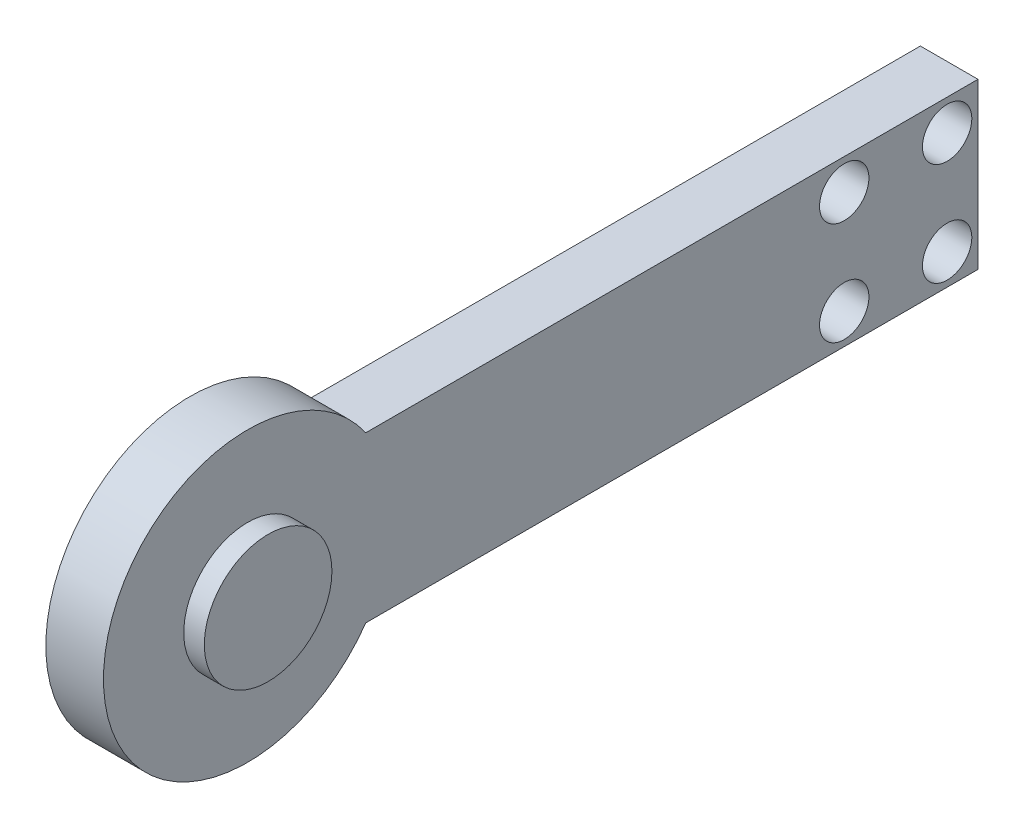
ISO-10303-21;
HEADER;
FILE_DESCRIPTION(('STEP AP214'),'2;1');
FILE_NAME('part.step','',(''),(''),'','','');
FILE_SCHEMA(('AUTOMOTIVE_DESIGN { 1 0 10303 214 1 1 1 1 }'));
ENDSEC;
DATA;
#1=APPLICATION_CONTEXT('core data for automotive mechanical design processes');
#2=APPLICATION_PROTOCOL_DEFINITION('international standard','automotive_design',2000,#1);
#3=PRODUCT_CONTEXT('',#1,'mechanical');
#4=PRODUCT('Part','Part','',(#3));
#5=PRODUCT_RELATED_PRODUCT_CATEGORY('part','',(#4));
#6=PRODUCT_DEFINITION_FORMATION('','',#4);
#7=PRODUCT_DEFINITION_CONTEXT('part definition',#1,'design');
#8=PRODUCT_DEFINITION('design','',#6,#7);
#9=PRODUCT_DEFINITION_SHAPE('','',#8);
#10=(LENGTH_UNIT() NAMED_UNIT(*) SI_UNIT(.MILLI.,.METRE.));
#11=(NAMED_UNIT(*) PLANE_ANGLE_UNIT() SI_UNIT($,.RADIAN.));
#12=(NAMED_UNIT(*) SI_UNIT($,.STERADIAN.) SOLID_ANGLE_UNIT());
#13=UNCERTAINTY_MEASURE_WITH_UNIT(LENGTH_MEASURE(1.E-05),#10,'distance_accuracy_value','');
#14=(GEOMETRIC_REPRESENTATION_CONTEXT(3) GLOBAL_UNCERTAINTY_ASSIGNED_CONTEXT((#13)) GLOBAL_UNIT_ASSIGNED_CONTEXT((#10,
#11,#12)) REPRESENTATION_CONTEXT('',''));
#15=CARTESIAN_POINT('',(0.,0.,0.));
#16=DIRECTION('',(0.,0.,1.));
#17=DIRECTION('',(1.,0.,0.));
#18=AXIS2_PLACEMENT_3D('',#15,#16,#17);
#19=CARTESIAN_POINT('',(14.,-20.,-177.44562646538));
#20=DIRECTION('',(0.,0.,1.));
#21=DIRECTION('',(1.,0.,0.));
#22=AXIS2_PLACEMENT_3D('',#19,#20,#21);
#23=PLANE('',#22);
#24=DIRECTION('',(0.,1.,0.));
#25=VECTOR('',#24,1.);
#26=CARTESIAN_POINT('',(0.,-20.,-177.44562646538));
#27=LINE('',#26,#25);
#28=CARTESIAN_POINT('',(0.,-20.,-177.44562646538));
#29=VERTEX_POINT('',#28);
#30=CARTESIAN_POINT('',(0.,20.,-177.44562646538));
#31=VERTEX_POINT('',#30);
#32=EDGE_CURVE('E100',#29,#31,#27,.T.);
#33=ORIENTED_EDGE('',*,*,#32,.T.);
#34=DIRECTION('',(-1.,0.,0.));
#35=VECTOR('',#34,1.);
#36=CARTESIAN_POINT('',(14.,20.,-177.44562646538));
#37=LINE('',#36,#35);
#38=CARTESIAN_POINT('',(14.,20.,-177.44562646538));
#39=VERTEX_POINT('',#38);
#40=EDGE_CURVE('E11',#39,#31,#37,.T.);
#41=ORIENTED_EDGE('',*,*,#40,.F.);
#42=DIRECTION('',(0.,1.,0.));
#43=VECTOR('',#42,1.);
#44=CARTESIAN_POINT('',(14.,-20.,-177.44562646538));
#45=LINE('',#44,#43);
#46=CARTESIAN_POINT('',(14.,-20.,-177.44562646538));
#47=VERTEX_POINT('',#46);
#48=EDGE_CURVE('E88',#47,#39,#45,.T.);
#49=ORIENTED_EDGE('',*,*,#48,.F.);
#50=DIRECTION('',(-1.,0.,0.));
#51=VECTOR('',#50,1.);
#52=CARTESIAN_POINT('',(14.,-20.,-177.44562646538));
#53=LINE('',#52,#51);
#54=EDGE_CURVE('E96',#47,#29,#53,.T.);
#55=ORIENTED_EDGE('',*,*,#54,.T.);
#56=EDGE_LOOP('',(#33,#41,#49,#55));
#57=FACE_BOUND('',#56,.T.);
#58=ADVANCED_FACE('F37',(#57),#23,.F.);
#59=CARTESIAN_POINT('',(14.,20.,-177.44562646538));
#60=DIRECTION('',(0.,-1.,0.));
#61=DIRECTION('',(0.,0.,-1.));
#62=AXIS2_PLACEMENT_3D('',#59,#60,#61);
#63=PLANE('',#62);
#64=DIRECTION('',(0.,0.,1.));
#65=VECTOR('',#64,1.);
#66=CARTESIAN_POINT('',(0.,20.,-177.44562646538));
#67=LINE('',#66,#65);
#68=CARTESIAN_POINT('',(0.,20.,-28.7228132326902));
#69=VERTEX_POINT('',#68);
#70=EDGE_CURVE('E92',#31,#69,#67,.T.);
#71=ORIENTED_EDGE('',*,*,#70,.T.);
#72=DIRECTION('',(-1.,0.,0.));
#73=VECTOR('',#72,1.);
#74=CARTESIAN_POINT('',(14.,20.,-28.7228132326902));
#75=LINE('',#74,#73);
#76=CARTESIAN_POINT('',(14.,20.,-28.7228132326902));
#77=VERTEX_POINT('',#76);
#78=EDGE_CURVE('E45',#77,#69,#75,.T.);
#79=ORIENTED_EDGE('',*,*,#78,.F.);
#80=DIRECTION('',(0.,0.,1.));
#81=VECTOR('',#80,1.);
#82=CARTESIAN_POINT('',(14.,20.,-177.44562646538));
#83=LINE('',#82,#81);
#84=EDGE_CURVE('E83',#39,#77,#83,.T.);
#85=ORIENTED_EDGE('',*,*,#84,.F.);
#86=ORIENTED_EDGE('',*,*,#40,.T.);
#87=EDGE_LOOP('',(#71,#79,#85,#86));
#88=FACE_BOUND('',#87,.T.);
#89=ADVANCED_FACE('F91',(#88),#63,.F.);
#90=CARTESIAN_POINT('',(14.,0.,0.));
#91=DIRECTION('',(-1.,0.,0.));
#92=DIRECTION('',(0.,0.,1.));
#93=AXIS2_PLACEMENT_3D('',#90,#91,#92);
#94=CYLINDRICAL_SURFACE('',#93,35.);
#95=CARTESIAN_POINT('',(0.,0.,0.));
#96=DIRECTION('',(1.,0.,0.));
#97=DIRECTION('',(0.,0.,-1.));
#98=AXIS2_PLACEMENT_3D('',#95,#96,#97);
#99=CIRCLE('',#98,35.);
#100=CARTESIAN_POINT('',(0.,-20.,-28.7228132326901));
#101=VERTEX_POINT('',#100);
#102=EDGE_CURVE('E70',#69,#101,#99,.T.);
#103=ORIENTED_EDGE('',*,*,#102,.T.);
#104=DIRECTION('',(-1.,0.,0.));
#105=VECTOR('',#104,1.);
#106=CARTESIAN_POINT('',(14.,-20.,-28.7228132326901));
#107=LINE('',#106,#105);
#108=CARTESIAN_POINT('',(14.,-20.,-28.7228132326901));
#109=VERTEX_POINT('',#108);
#110=EDGE_CURVE('E93',#109,#101,#107,.T.);
#111=ORIENTED_EDGE('',*,*,#110,.F.);
#112=CARTESIAN_POINT('',(14.,0.,0.));
#113=DIRECTION('',(1.,0.,0.));
#114=DIRECTION('',(0.,0.,-1.));
#115=AXIS2_PLACEMENT_3D('',#112,#113,#114);
#116=CIRCLE('',#115,35.);
#117=EDGE_CURVE('E86',#77,#109,#116,.T.);
#118=ORIENTED_EDGE('',*,*,#117,.F.);
#119=ORIENTED_EDGE('',*,*,#78,.T.);
#120=EDGE_LOOP('',(#103,#111,#118,#119));
#121=FACE_BOUND('',#120,.T.);
#122=ADVANCED_FACE('F94',(#121),#94,.T.);
#123=CARTESIAN_POINT('',(14.,-20.,-177.44562646538));
#124=DIRECTION('',(0.,1.,0.));
#125=DIRECTION('',(0.,0.,1.));
#126=AXIS2_PLACEMENT_3D('',#123,#124,#125);
#127=PLANE('',#126);
#128=DIRECTION('',(0.,0.,-1.));
#129=VECTOR('',#128,1.);
#130=CARTESIAN_POINT('',(0.,-20.,-177.44562646538));
#131=LINE('',#130,#129);
#132=EDGE_CURVE('E76',#101,#29,#131,.T.);
#133=ORIENTED_EDGE('',*,*,#132,.T.);
#134=ORIENTED_EDGE('',*,*,#54,.F.);
#135=DIRECTION('',(0.,0.,-1.));
#136=VECTOR('',#135,1.);
#137=CARTESIAN_POINT('',(14.,-20.,-177.44562646538));
#138=LINE('',#137,#136);
#139=EDGE_CURVE('E53',#109,#47,#138,.T.);
#140=ORIENTED_EDGE('',*,*,#139,.F.);
#141=ORIENTED_EDGE('',*,*,#110,.T.);
#142=EDGE_LOOP('',(#133,#134,#140,#141));
#143=FACE_BOUND('',#142,.T.);
#144=ADVANCED_FACE('F108',(#143),#127,.F.);
#145=CARTESIAN_POINT('',(14.,0.,0.));
#146=DIRECTION('',(1.,0.,0.));
#147=DIRECTION('',(0.,0.,-1.));
#148=AXIS2_PLACEMENT_3D('',#145,#146,#147);
#149=PLANE('',#148);
#150=CARTESIAN_POINT('',(14.,-12.5,-169.94562646538));
#151=DIRECTION('',(1.,0.,0.));
#152=DIRECTION('',(0.,0.,-1.));
#153=AXIS2_PLACEMENT_3D('',#150,#151,#152);
#154=CIRCLE('',#153,6.00000000000002);
#155=CARTESIAN_POINT('',(14.,-12.5,-175.94562646538));
#156=VERTEX_POINT('',#155);
#157=EDGE_CURVE('E117',#156,#156,#154,.T.);
#158=ORIENTED_EDGE('',*,*,#157,.F.);
#159=EDGE_LOOP('',(#158));
#160=FACE_BOUND('',#159,.T.);
#161=CARTESIAN_POINT('',(14.,-12.5,-144.94562646538));
#162=DIRECTION('',(1.,0.,0.));
#163=DIRECTION('',(0.,0.,-1.));
#164=AXIS2_PLACEMENT_3D('',#161,#162,#163);
#165=CIRCLE('',#164,6.00000000000002);
#166=CARTESIAN_POINT('',(14.,-12.5,-150.94562646538));
#167=VERTEX_POINT('',#166);
#168=EDGE_CURVE('E122',#167,#167,#165,.T.);
#169=ORIENTED_EDGE('',*,*,#168,.F.);
#170=EDGE_LOOP('',(#169));
#171=FACE_BOUND('',#170,.T.);
#172=CARTESIAN_POINT('',(14.,12.5,-144.94562646538));
#173=DIRECTION('',(1.,0.,0.));
#174=DIRECTION('',(0.,0.,-1.));
#175=AXIS2_PLACEMENT_3D('',#172,#173,#174);
#176=CIRCLE('',#175,6.00000000000002);
#177=CARTESIAN_POINT('',(14.,12.5,-150.94562646538));
#178=VERTEX_POINT('',#177);
#179=EDGE_CURVE('E125',#178,#178,#176,.T.);
#180=ORIENTED_EDGE('',*,*,#179,.F.);
#181=EDGE_LOOP('',(#180));
#182=FACE_BOUND('',#181,.T.);
#183=CARTESIAN_POINT('',(14.,12.5,-169.94562646538));
#184=DIRECTION('',(1.,0.,0.));
#185=DIRECTION('',(0.,0.,-1.));
#186=AXIS2_PLACEMENT_3D('',#183,#184,#185);
#187=CIRCLE('',#186,6.00000000000002);
#188=CARTESIAN_POINT('',(14.,12.5,-175.94562646538));
#189=VERTEX_POINT('',#188);
#190=EDGE_CURVE('E128',#189,#189,#187,.T.);
#191=ORIENTED_EDGE('',*,*,#190,.F.);
#192=EDGE_LOOP('',(#191));
#193=FACE_BOUND('',#192,.T.);
#194=CARTESIAN_POINT('',(14.,0.,0.));
#195=DIRECTION('',(1.,0.,0.));
#196=DIRECTION('',(0.,0.,-1.));
#197=AXIS2_PLACEMENT_3D('',#194,#195,#196);
#198=CIRCLE('',#197,15.5);
#199=CARTESIAN_POINT('',(14.,0.,-15.5));
#200=VERTEX_POINT('',#199);
#201=EDGE_CURVE('E114',#200,#200,#198,.T.);
#202=ORIENTED_EDGE('',*,*,#201,.F.);
#203=EDGE_LOOP('',(#202));
#204=FACE_BOUND('',#203,.T.);
#205=ORIENTED_EDGE('',*,*,#48,.T.);
#206=ORIENTED_EDGE('',*,*,#84,.T.);
#207=ORIENTED_EDGE('',*,*,#117,.T.);
#208=ORIENTED_EDGE('',*,*,#139,.T.);
#209=EDGE_LOOP('',(#205,#206,#207,#208));
#210=FACE_BOUND('',#209,.T.);
#211=ADVANCED_FACE('F84',(#160,#171,#182,#193,#204,#210),#149,.T.);
#212=CARTESIAN_POINT('',(0.,0.,0.));
#213=DIRECTION('',(1.,0.,0.));
#214=DIRECTION('',(0.,0.,-1.));
#215=AXIS2_PLACEMENT_3D('',#212,#213,#214);
#216=PLANE('',#215);
#217=CARTESIAN_POINT('',(0.,-12.5,-169.94562646538));
#218=DIRECTION('',(1.,0.,0.));
#219=DIRECTION('',(0.,0.,1.));
#220=AXIS2_PLACEMENT_3D('',#217,#218,#219);
#221=CIRCLE('',#220,6.00000000000002);
#222=CARTESIAN_POINT('',(0.,-12.5,-163.94562646538));
#223=VERTEX_POINT('',#222);
#224=EDGE_CURVE('E135',#223,#223,#221,.T.);
#225=ORIENTED_EDGE('',*,*,#224,.T.);
#226=EDGE_LOOP('',(#225));
#227=FACE_BOUND('',#226,.T.);
#228=CARTESIAN_POINT('',(0.,-12.5,-144.94562646538));
#229=DIRECTION('',(1.,0.,0.));
#230=DIRECTION('',(0.,0.,1.));
#231=AXIS2_PLACEMENT_3D('',#228,#229,#230);
#232=CIRCLE('',#231,6.00000000000002);
#233=CARTESIAN_POINT('',(0.,-12.5,-138.94562646538));
#234=VERTEX_POINT('',#233);
#235=EDGE_CURVE('E138',#234,#234,#232,.T.);
#236=ORIENTED_EDGE('',*,*,#235,.T.);
#237=EDGE_LOOP('',(#236));
#238=FACE_BOUND('',#237,.T.);
#239=CARTESIAN_POINT('',(0.,12.5,-144.94562646538));
#240=DIRECTION('',(1.,0.,0.));
#241=DIRECTION('',(0.,0.,-1.));
#242=AXIS2_PLACEMENT_3D('',#239,#240,#241);
#243=CIRCLE('',#242,6.00000000000002);
#244=CARTESIAN_POINT('',(0.,12.5,-150.94562646538));
#245=VERTEX_POINT('',#244);
#246=EDGE_CURVE('E134',#245,#245,#243,.T.);
#247=ORIENTED_EDGE('',*,*,#246,.T.);
#248=EDGE_LOOP('',(#247));
#249=FACE_BOUND('',#248,.T.);
#250=CARTESIAN_POINT('',(0.,12.5,-169.94562646538));
#251=DIRECTION('',(1.,0.,0.));
#252=DIRECTION('',(0.,0.,-1.));
#253=AXIS2_PLACEMENT_3D('',#250,#251,#252);
#254=CIRCLE('',#253,6.00000000000002);
#255=CARTESIAN_POINT('',(0.,12.5,-175.94562646538));
#256=VERTEX_POINT('',#255);
#257=EDGE_CURVE('E131',#256,#256,#254,.T.);
#258=ORIENTED_EDGE('',*,*,#257,.T.);
#259=EDGE_LOOP('',(#258));
#260=FACE_BOUND('',#259,.T.);
#261=ORIENTED_EDGE('',*,*,#32,.F.);
#262=ORIENTED_EDGE('',*,*,#132,.F.);
#263=ORIENTED_EDGE('',*,*,#102,.F.);
#264=ORIENTED_EDGE('',*,*,#70,.F.);
#265=EDGE_LOOP('',(#261,#262,#263,#264));
#266=FACE_BOUND('',#265,.T.);
#267=ADVANCED_FACE('F111',(#227,#238,#249,#260,#266),#216,.F.);
#268=CARTESIAN_POINT('',(19.,0.,0.));
#269=DIRECTION('',(-1.,0.,0.));
#270=DIRECTION('',(0.,0.,1.));
#271=AXIS2_PLACEMENT_3D('',#268,#269,#270);
#272=CYLINDRICAL_SURFACE('',#271,15.5);
#273=CARTESIAN_POINT('',(19.,0.,0.));
#274=DIRECTION('',(1.,0.,0.));
#275=DIRECTION('',(0.,0.,-1.));
#276=AXIS2_PLACEMENT_3D('',#273,#274,#275);
#277=CIRCLE('',#276,15.5);
#278=CARTESIAN_POINT('',(19.,0.,-15.5));
#279=VERTEX_POINT('',#278);
#280=EDGE_CURVE('E103',#279,#279,#277,.T.);
#281=ORIENTED_EDGE('',*,*,#280,.F.);
#282=EDGE_LOOP('',(#281));
#283=FACE_BOUND('',#282,.T.);
#284=ORIENTED_EDGE('',*,*,#201,.T.);
#285=EDGE_LOOP('',(#284));
#286=FACE_BOUND('',#285,.T.);
#287=ADVANCED_FACE('F175',(#283,#286),#272,.T.);
#288=CARTESIAN_POINT('',(19.,0.,0.));
#289=DIRECTION('',(1.,0.,0.));
#290=DIRECTION('',(0.,0.,-1.));
#291=AXIS2_PLACEMENT_3D('',#288,#289,#290);
#292=PLANE('',#291);
#293=ORIENTED_EDGE('',*,*,#280,.T.);
#294=EDGE_LOOP('',(#293));
#295=FACE_BOUND('',#294,.T.);
#296=ADVANCED_FACE('F159',(#295),#292,.T.);
#297=CARTESIAN_POINT('',(0.,12.5,-169.94562646538));
#298=DIRECTION('',(1.,0.,0.));
#299=DIRECTION('',(0.,0.,-1.));
#300=AXIS2_PLACEMENT_3D('',#297,#298,#299);
#301=CYLINDRICAL_SURFACE('',#300,6.00000000000002);
#302=ORIENTED_EDGE('',*,*,#190,.T.);
#303=EDGE_LOOP('',(#302));
#304=FACE_BOUND('',#303,.T.);
#305=ORIENTED_EDGE('',*,*,#257,.F.);
#306=EDGE_LOOP('',(#305));
#307=FACE_BOUND('',#306,.T.);
#308=ADVANCED_FACE('F149',(#304,#307),#301,.F.);
#309=CARTESIAN_POINT('',(0.,12.5,-144.94562646538));
#310=DIRECTION('',(1.,0.,0.));
#311=DIRECTION('',(0.,0.,-1.));
#312=AXIS2_PLACEMENT_3D('',#309,#310,#311);
#313=CYLINDRICAL_SURFACE('',#312,6.00000000000002);
#314=ORIENTED_EDGE('',*,*,#179,.T.);
#315=EDGE_LOOP('',(#314));
#316=FACE_BOUND('',#315,.T.);
#317=ORIENTED_EDGE('',*,*,#246,.F.);
#318=EDGE_LOOP('',(#317));
#319=FACE_BOUND('',#318,.T.);
#320=ADVANCED_FACE('F146',(#316,#319),#313,.F.);
#321=CARTESIAN_POINT('',(0.,-12.5,-144.94562646538));
#322=DIRECTION('',(1.,0.,0.));
#323=DIRECTION('',(0.,0.,-1.));
#324=AXIS2_PLACEMENT_3D('',#321,#322,#323);
#325=CYLINDRICAL_SURFACE('',#324,6.00000000000002);
#326=ORIENTED_EDGE('',*,*,#168,.T.);
#327=EDGE_LOOP('',(#326));
#328=FACE_BOUND('',#327,.T.);
#329=ORIENTED_EDGE('',*,*,#235,.F.);
#330=EDGE_LOOP('',(#329));
#331=FACE_BOUND('',#330,.T.);
#332=ADVANCED_FACE('F148',(#328,#331),#325,.F.);
#333=CARTESIAN_POINT('',(0.,-12.5,-169.94562646538));
#334=DIRECTION('',(1.,0.,0.));
#335=DIRECTION('',(0.,0.,-1.));
#336=AXIS2_PLACEMENT_3D('',#333,#334,#335);
#337=CYLINDRICAL_SURFACE('',#336,6.00000000000002);
#338=ORIENTED_EDGE('',*,*,#157,.T.);
#339=EDGE_LOOP('',(#338));
#340=FACE_BOUND('',#339,.T.);
#341=ORIENTED_EDGE('',*,*,#224,.F.);
#342=EDGE_LOOP('',(#341));
#343=FACE_BOUND('',#342,.T.);
#344=ADVANCED_FACE('F156',(#340,#343),#337,.F.);
#345=CLOSED_SHELL('',(#58,#89,#122,#144,#211,#267,#287,#296,#308,#320,#332,#344));
#346=MANIFOLD_SOLID_BREP('B2',#345);
#347=ADVANCED_BREP_SHAPE_REPRESENTATION('',(#18,#346),#14);
#348=SHAPE_DEFINITION_REPRESENTATION(#9,#347);
ENDSEC;
END-ISO-10303-21;
